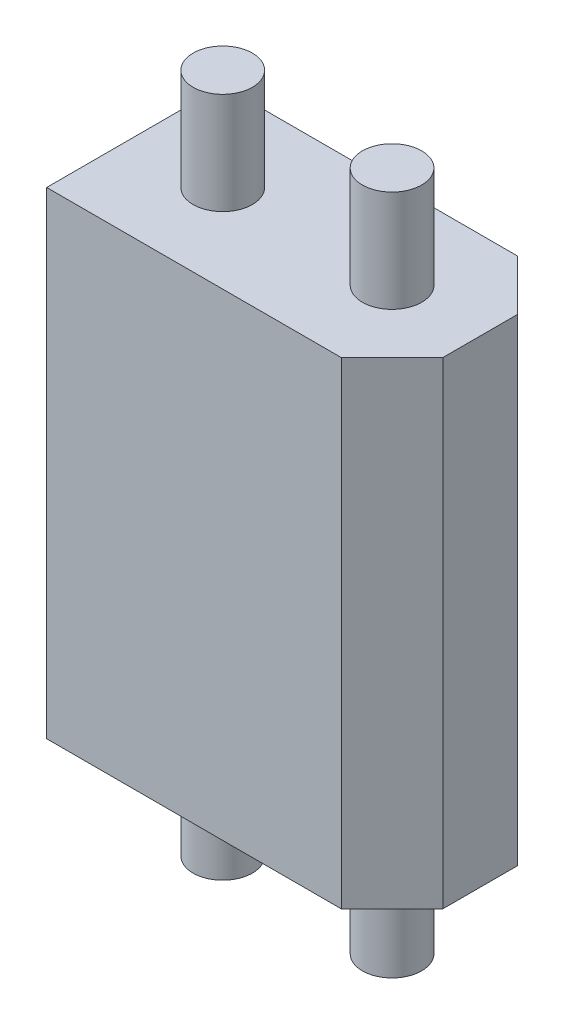
ISO-10303-21;
HEADER;
FILE_DESCRIPTION(('STEP AP214'),'2;1');
FILE_NAME('part.step','',(''),(''),'','','');
FILE_SCHEMA(('AUTOMOTIVE_DESIGN { 1 0 10303 214 1 1 1 1 }'));
ENDSEC;
DATA;
#1=APPLICATION_CONTEXT('core data for automotive mechanical design processes');
#2=APPLICATION_PROTOCOL_DEFINITION('international standard','automotive_design',2000,#1);
#3=PRODUCT_CONTEXT('',#1,'mechanical');
#4=PRODUCT('Part','Part','',(#3));
#5=PRODUCT_RELATED_PRODUCT_CATEGORY('part','',(#4));
#6=PRODUCT_DEFINITION_FORMATION('','',#4);
#7=PRODUCT_DEFINITION_CONTEXT('part definition',#1,'design');
#8=PRODUCT_DEFINITION('design','',#6,#7);
#9=PRODUCT_DEFINITION_SHAPE('','',#8);
#10=(LENGTH_UNIT() NAMED_UNIT(*) SI_UNIT(.MILLI.,.METRE.));
#11=(NAMED_UNIT(*) PLANE_ANGLE_UNIT() SI_UNIT($,.RADIAN.));
#12=(NAMED_UNIT(*) SI_UNIT($,.STERADIAN.) SOLID_ANGLE_UNIT());
#13=UNCERTAINTY_MEASURE_WITH_UNIT(LENGTH_MEASURE(1.E-05),#10,'distance_accuracy_value','');
#14=(GEOMETRIC_REPRESENTATION_CONTEXT(3) GLOBAL_UNCERTAINTY_ASSIGNED_CONTEXT((#13)) GLOBAL_UNIT_ASSIGNED_CONTEXT((#10,
#11,#12)) REPRESENTATION_CONTEXT('',''));
#15=CARTESIAN_POINT('',(0.,0.,0.));
#16=DIRECTION('',(0.,0.,1.));
#17=DIRECTION('',(1.,0.,0.));
#18=AXIS2_PLACEMENT_3D('',#15,#16,#17);
#19=CARTESIAN_POINT('',(5.1,7.05,2.6));
#20=DIRECTION('',(-1.,0.,0.));
#21=DIRECTION('',(0.,0.,1.));
#22=AXIS2_PLACEMENT_3D('',#19,#20,#21);
#23=PLANE('',#22);
#24=DIRECTION('',(0.,0.,-1.));
#25=VECTOR('',#24,1.);
#26=CARTESIAN_POINT('',(5.1,-7.05,2.6));
#27=LINE('',#26,#25);
#28=CARTESIAN_POINT('',(5.1,-7.05,1.1));
#29=VERTEX_POINT('',#28);
#30=CARTESIAN_POINT('',(5.1,-7.05,-1.1));
#31=VERTEX_POINT('',#30);
#32=EDGE_CURVE('E149',#29,#31,#27,.T.);
#33=ORIENTED_EDGE('',*,*,#32,.T.);
#34=DIRECTION('',(0.,1.,0.));
#35=VECTOR('',#34,1.);
#36=CARTESIAN_POINT('',(5.1,7.05,-1.1));
#37=LINE('',#36,#35);
#38=CARTESIAN_POINT('',(5.1,7.05,-1.1));
#39=VERTEX_POINT('',#38);
#40=EDGE_CURVE('E82',#31,#39,#37,.T.);
#41=ORIENTED_EDGE('',*,*,#40,.T.);
#42=DIRECTION('',(0.,0.,-1.));
#43=VECTOR('',#42,1.);
#44=CARTESIAN_POINT('',(5.1,7.05,2.6));
#45=LINE('',#44,#43);
#46=CARTESIAN_POINT('',(5.1,7.05,1.1));
#47=VERTEX_POINT('',#46);
#48=EDGE_CURVE('E127',#47,#39,#45,.T.);
#49=ORIENTED_EDGE('',*,*,#48,.F.);
#50=DIRECTION('',(0.,-1.,0.));
#51=VECTOR('',#50,1.);
#52=CARTESIAN_POINT('',(5.1,7.05,1.1));
#53=LINE('',#52,#51);
#54=EDGE_CURVE('E170',#47,#29,#53,.T.);
#55=ORIENTED_EDGE('',*,*,#54,.T.);
#56=EDGE_LOOP('',(#33,#41,#49,#55));
#57=FACE_BOUND('',#56,.T.);
#58=ADVANCED_FACE('F55',(#57),#23,.F.);
#59=CARTESIAN_POINT('',(-5.1,7.05,-2.6));
#60=DIRECTION('',(0.,0.,1.));
#61=DIRECTION('',(1.,0.,0.));
#62=AXIS2_PLACEMENT_3D('',#59,#60,#61);
#63=PLANE('',#62);
#64=DIRECTION('',(-1.,0.,0.));
#65=VECTOR('',#64,1.);
#66=CARTESIAN_POINT('',(-5.1,7.05,-2.6));
#67=LINE('',#66,#65);
#68=CARTESIAN_POINT('',(3.6,7.05,-2.6));
#69=VERTEX_POINT('',#68);
#70=CARTESIAN_POINT('',(-5.1,7.05,-2.6));
#71=VERTEX_POINT('',#70);
#72=EDGE_CURVE('E115',#69,#71,#67,.T.);
#73=ORIENTED_EDGE('',*,*,#72,.F.);
#74=DIRECTION('',(0.,-1.,0.));
#75=VECTOR('',#74,1.);
#76=CARTESIAN_POINT('',(3.6,7.05,-2.6));
#77=LINE('',#76,#75);
#78=CARTESIAN_POINT('',(3.6,-7.05,-2.6));
#79=VERTEX_POINT('',#78);
#80=EDGE_CURVE('E137',#69,#79,#77,.T.);
#81=ORIENTED_EDGE('',*,*,#80,.T.);
#82=DIRECTION('',(-1.,0.,0.));
#83=VECTOR('',#82,1.);
#84=CARTESIAN_POINT('',(-5.1,-7.05,-2.6));
#85=LINE('',#84,#83);
#86=CARTESIAN_POINT('',(-5.1,-7.05,-2.6));
#87=VERTEX_POINT('',#86);
#88=EDGE_CURVE('E133',#79,#87,#85,.T.);
#89=ORIENTED_EDGE('',*,*,#88,.T.);
#90=DIRECTION('',(0.,-1.,0.));
#91=VECTOR('',#90,1.);
#92=CARTESIAN_POINT('',(-5.1,7.05,-2.6));
#93=LINE('',#92,#91);
#94=EDGE_CURVE('E130',#71,#87,#93,.T.);
#95=ORIENTED_EDGE('',*,*,#94,.F.);
#96=EDGE_LOOP('',(#73,#81,#89,#95));
#97=FACE_BOUND('',#96,.T.);
#98=ADVANCED_FACE('F131',(#97),#63,.F.);
#99=CARTESIAN_POINT('',(-5.1,7.05,2.6));
#100=DIRECTION('',(1.,0.,0.));
#101=DIRECTION('',(0.,0.,-1.));
#102=AXIS2_PLACEMENT_3D('',#99,#100,#101);
#103=PLANE('',#102);
#104=DIRECTION('',(0.,0.,1.));
#105=VECTOR('',#104,1.);
#106=CARTESIAN_POINT('',(-5.1,-7.05,2.6));
#107=LINE('',#106,#105);
#108=CARTESIAN_POINT('',(-5.1,-7.05,2.6));
#109=VERTEX_POINT('',#108);
#110=EDGE_CURVE('E154',#87,#109,#107,.T.);
#111=ORIENTED_EDGE('',*,*,#110,.T.);
#112=DIRECTION('',(0.,-1.,0.));
#113=VECTOR('',#112,1.);
#114=CARTESIAN_POINT('',(-5.1,7.05,2.6));
#115=LINE('',#114,#113);
#116=CARTESIAN_POINT('',(-5.1,7.05,2.6));
#117=VERTEX_POINT('',#116);
#118=EDGE_CURVE('E138',#117,#109,#115,.T.);
#119=ORIENTED_EDGE('',*,*,#118,.F.);
#120=DIRECTION('',(0.,0.,1.));
#121=VECTOR('',#120,1.);
#122=CARTESIAN_POINT('',(-5.1,7.05,2.6));
#123=LINE('',#122,#121);
#124=EDGE_CURVE('E119',#71,#117,#123,.T.);
#125=ORIENTED_EDGE('',*,*,#124,.F.);
#126=ORIENTED_EDGE('',*,*,#94,.T.);
#127=EDGE_LOOP('',(#111,#119,#125,#126));
#128=FACE_BOUND('',#127,.T.);
#129=ADVANCED_FACE('F140',(#128),#103,.F.);
#130=CARTESIAN_POINT('',(-5.1,7.05,2.6));
#131=DIRECTION('',(0.,0.,-1.));
#132=DIRECTION('',(-1.,0.,0.));
#133=AXIS2_PLACEMENT_3D('',#130,#131,#132);
#134=PLANE('',#133);
#135=DIRECTION('',(1.,0.,0.));
#136=VECTOR('',#135,1.);
#137=CARTESIAN_POINT('',(-5.1,-7.05,2.6));
#138=LINE('',#137,#136);
#139=CARTESIAN_POINT('',(3.6,-7.05,2.6));
#140=VERTEX_POINT('',#139);
#141=EDGE_CURVE('E157',#109,#140,#138,.T.);
#142=ORIENTED_EDGE('',*,*,#141,.T.);
#143=DIRECTION('',(0.,1.,0.));
#144=VECTOR('',#143,1.);
#145=CARTESIAN_POINT('',(3.6,7.05,2.6));
#146=LINE('',#145,#144);
#147=CARTESIAN_POINT('',(3.6,7.05,2.6));
#148=VERTEX_POINT('',#147);
#149=EDGE_CURVE('E74',#140,#148,#146,.T.);
#150=ORIENTED_EDGE('',*,*,#149,.T.);
#151=DIRECTION('',(1.,0.,0.));
#152=VECTOR('',#151,1.);
#153=CARTESIAN_POINT('',(-5.1,7.05,2.6));
#154=LINE('',#153,#152);
#155=EDGE_CURVE('E143',#117,#148,#154,.T.);
#156=ORIENTED_EDGE('',*,*,#155,.F.);
#157=ORIENTED_EDGE('',*,*,#118,.T.);
#158=EDGE_LOOP('',(#142,#150,#156,#157));
#159=FACE_BOUND('',#158,.T.);
#160=ADVANCED_FACE('F219',(#159),#134,.F.);
#161=CARTESIAN_POINT('',(0.,7.05,0.));
#162=DIRECTION('',(0.,-1.,0.));
#163=DIRECTION('',(0.,0.,-1.));
#164=AXIS2_PLACEMENT_3D('',#161,#162,#163);
#165=PLANE('',#164);
#166=CARTESIAN_POINT('',(-2.5,7.05,0.));
#167=DIRECTION('',(0.,-1.,0.));
#168=DIRECTION('',(0.,0.,-1.));
#169=AXIS2_PLACEMENT_3D('',#166,#167,#168);
#170=CIRCLE('',#169,0.875);
#171=CARTESIAN_POINT('',(-2.5,7.05,-0.875));
#172=VERTEX_POINT('',#171);
#173=EDGE_CURVE('E12',#172,#172,#170,.F.);
#174=ORIENTED_EDGE('',*,*,#173,.F.);
#175=EDGE_LOOP('',(#174));
#176=FACE_BOUND('',#175,.T.);
#177=CARTESIAN_POINT('',(2.5,7.05,0.));
#178=DIRECTION('',(0.,-1.,0.));
#179=DIRECTION('',(0.,0.,-1.));
#180=AXIS2_PLACEMENT_3D('',#177,#178,#179);
#181=CIRCLE('',#180,0.875);
#182=CARTESIAN_POINT('',(2.5,7.05,-0.875000000000001));
#183=VERTEX_POINT('',#182);
#184=EDGE_CURVE('E66',#183,#183,#181,.F.);
#185=ORIENTED_EDGE('',*,*,#184,.F.);
#186=EDGE_LOOP('',(#185));
#187=FACE_BOUND('',#186,.T.);
#188=ORIENTED_EDGE('',*,*,#48,.T.);
#189=DIRECTION('',(0.707106781186547,0.,0.707106781186548));
#190=VECTOR('',#189,1.);
#191=CARTESIAN_POINT('',(3.6,7.05,-2.6));
#192=LINE('',#191,#190);
#193=EDGE_CURVE('E122',#39,#69,#192,.F.);
#194=ORIENTED_EDGE('',*,*,#193,.T.);
#195=ORIENTED_EDGE('',*,*,#72,.T.);
#196=ORIENTED_EDGE('',*,*,#124,.T.);
#197=ORIENTED_EDGE('',*,*,#155,.T.);
#198=DIRECTION('',(-0.707106781186548,0.,0.707106781186547));
#199=VECTOR('',#198,1.);
#200=CARTESIAN_POINT('',(5.1,7.05,1.1));
#201=LINE('',#200,#199);
#202=EDGE_CURVE('E176',#148,#47,#201,.F.);
#203=ORIENTED_EDGE('',*,*,#202,.T.);
#204=EDGE_LOOP('',(#188,#194,#195,#196,#197,#203));
#205=FACE_BOUND('',#204,.T.);
#206=ADVANCED_FACE('F117',(#176,#187,#205),#165,.F.);
#207=CARTESIAN_POINT('',(0.,-7.05,0.));
#208=DIRECTION('',(0.,-1.,0.));
#209=DIRECTION('',(0.,0.,-1.));
#210=AXIS2_PLACEMENT_3D('',#207,#208,#209);
#211=PLANE('',#210);
#212=CARTESIAN_POINT('',(-2.5,-7.05,0.));
#213=DIRECTION('',(0.,-1.,0.));
#214=DIRECTION('',(0.,0.,-1.));
#215=AXIS2_PLACEMENT_3D('',#212,#213,#214);
#216=CIRCLE('',#215,0.875);
#217=CARTESIAN_POINT('',(-2.5,-7.05,-0.875));
#218=VERTEX_POINT('',#217);
#219=EDGE_CURVE('E60',#218,#218,#216,.F.);
#220=ORIENTED_EDGE('',*,*,#219,.T.);
#221=EDGE_LOOP('',(#220));
#222=FACE_BOUND('',#221,.T.);
#223=CARTESIAN_POINT('',(2.5,-7.05,0.));
#224=DIRECTION('',(0.,-1.,0.));
#225=DIRECTION('',(0.,0.,-1.));
#226=AXIS2_PLACEMENT_3D('',#223,#224,#225);
#227=CIRCLE('',#226,0.875);
#228=CARTESIAN_POINT('',(2.5,-7.05,-0.875000000000001));
#229=VERTEX_POINT('',#228);
#230=EDGE_CURVE('E182',#229,#229,#227,.F.);
#231=ORIENTED_EDGE('',*,*,#230,.T.);
#232=EDGE_LOOP('',(#231));
#233=FACE_BOUND('',#232,.T.);
#234=ORIENTED_EDGE('',*,*,#88,.F.);
#235=DIRECTION('',(-0.707106781186547,0.,-0.707106781186548));
#236=VECTOR('',#235,1.);
#237=CARTESIAN_POINT('',(3.1,-7.05,-3.1));
#238=LINE('',#237,#236);
#239=EDGE_CURVE('E167',#79,#31,#238,.F.);
#240=ORIENTED_EDGE('',*,*,#239,.T.);
#241=ORIENTED_EDGE('',*,*,#32,.F.);
#242=DIRECTION('',(0.707106781186548,0.,-0.707106781186547));
#243=VECTOR('',#242,1.);
#244=CARTESIAN_POINT('',(3.09999999999999,-7.05,3.1));
#245=LINE('',#244,#243);
#246=EDGE_CURVE('E164',#29,#140,#245,.F.);
#247=ORIENTED_EDGE('',*,*,#246,.T.);
#248=ORIENTED_EDGE('',*,*,#141,.F.);
#249=ORIENTED_EDGE('',*,*,#110,.F.);
#250=EDGE_LOOP('',(#234,#240,#241,#247,#248,#249));
#251=FACE_BOUND('',#250,.T.);
#252=ADVANCED_FACE('F216',(#222,#233,#251),#211,.T.);
#253=CARTESIAN_POINT('',(3.6,7.05,-2.6));
#254=DIRECTION('',(-0.707106781186548,0.,0.707106781186547));
#255=DIRECTION('',(0.,-1.,0.));
#256=AXIS2_PLACEMENT_3D('',#253,#254,#255);
#257=PLANE('',#256);
#258=ORIENTED_EDGE('',*,*,#193,.F.);
#259=ORIENTED_EDGE('',*,*,#40,.F.);
#260=ORIENTED_EDGE('',*,*,#239,.F.);
#261=ORIENTED_EDGE('',*,*,#80,.F.);
#262=EDGE_LOOP('',(#258,#259,#260,#261));
#263=FACE_BOUND('',#262,.T.);
#264=ADVANCED_FACE('F214',(#263),#257,.F.);
#265=CARTESIAN_POINT('',(5.1,7.05,1.1));
#266=DIRECTION('',(-0.707106781186547,0.,-0.707106781186548));
#267=DIRECTION('',(0.,-1.,0.));
#268=AXIS2_PLACEMENT_3D('',#265,#266,#267);
#269=PLANE('',#268);
#270=ORIENTED_EDGE('',*,*,#202,.F.);
#271=ORIENTED_EDGE('',*,*,#149,.F.);
#272=ORIENTED_EDGE('',*,*,#246,.F.);
#273=ORIENTED_EDGE('',*,*,#54,.F.);
#274=EDGE_LOOP('',(#270,#271,#272,#273));
#275=FACE_BOUND('',#274,.T.);
#276=ADVANCED_FACE('F58',(#275),#269,.F.);
#277=CARTESIAN_POINT('',(0.,-10.05,0.));
#278=DIRECTION('',(0.,-1.,0.));
#279=DIRECTION('',(0.,0.,-1.));
#280=AXIS2_PLACEMENT_3D('',#277,#278,#279);
#281=PLANE('',#280);
#282=CARTESIAN_POINT('',(2.5,-10.05,0.));
#283=DIRECTION('',(0.,-1.,0.));
#284=DIRECTION('',(0.,0.,-1.));
#285=AXIS2_PLACEMENT_3D('',#282,#283,#284);
#286=CIRCLE('',#285,0.875);
#287=CARTESIAN_POINT('',(2.5,-10.05,-0.875000000000001));
#288=VERTEX_POINT('',#287);
#289=EDGE_CURVE('E198',#288,#288,#286,.F.);
#290=ORIENTED_EDGE('',*,*,#289,.F.);
#291=EDGE_LOOP('',(#290));
#292=FACE_BOUND('',#291,.T.);
#293=ADVANCED_FACE('F237',(#292),#281,.T.);
#294=CARTESIAN_POINT('',(2.5,15.5248737341529,0.));
#295=DIRECTION('',(0.,-1.,0.));
#296=DIRECTION('',(0.,0.,-1.));
#297=AXIS2_PLACEMENT_3D('',#294,#295,#296);
#298=CYLINDRICAL_SURFACE('',#297,0.875);
#299=ORIENTED_EDGE('',*,*,#230,.F.);
#300=EDGE_LOOP('',(#299));
#301=FACE_BOUND('',#300,.T.);
#302=ORIENTED_EDGE('',*,*,#289,.T.);
#303=EDGE_LOOP('',(#302));
#304=FACE_BOUND('',#303,.T.);
#305=ADVANCED_FACE('F297',(#301,#304),#298,.T.);
#306=CARTESIAN_POINT('',(0.,-10.05,0.));
#307=DIRECTION('',(0.,-1.,0.));
#308=DIRECTION('',(0.,0.,-1.));
#309=AXIS2_PLACEMENT_3D('',#306,#307,#308);
#310=PLANE('',#309);
#311=CARTESIAN_POINT('',(-2.5,-10.05,0.));
#312=DIRECTION('',(0.,-1.,0.));
#313=DIRECTION('',(0.,0.,-1.));
#314=AXIS2_PLACEMENT_3D('',#311,#312,#313);
#315=CIRCLE('',#314,0.875);
#316=CARTESIAN_POINT('',(-2.5,-10.05,-0.875));
#317=VERTEX_POINT('',#316);
#318=EDGE_CURVE('E192',#317,#317,#315,.F.);
#319=ORIENTED_EDGE('',*,*,#318,.F.);
#320=EDGE_LOOP('',(#319));
#321=FACE_BOUND('',#320,.T.);
#322=ADVANCED_FACE('F308',(#321),#310,.T.);
#323=CARTESIAN_POINT('',(-2.5,15.5248737341529,0.));
#324=DIRECTION('',(0.,-1.,0.));
#325=DIRECTION('',(0.,0.,-1.));
#326=AXIS2_PLACEMENT_3D('',#323,#324,#325);
#327=CYLINDRICAL_SURFACE('',#326,0.875);
#328=ORIENTED_EDGE('',*,*,#219,.F.);
#329=EDGE_LOOP('',(#328));
#330=FACE_BOUND('',#329,.T.);
#331=ORIENTED_EDGE('',*,*,#318,.T.);
#332=EDGE_LOOP('',(#331));
#333=FACE_BOUND('',#332,.T.);
#334=ADVANCED_FACE('F321',(#330,#333),#327,.T.);
#335=CARTESIAN_POINT('',(2.5,10.05,0.));
#336=DIRECTION('',(0.,-1.,0.));
#337=DIRECTION('',(0.,0.,-1.));
#338=AXIS2_PLACEMENT_3D('',#335,#336,#337);
#339=CIRCLE('',#338,0.875);
#340=CARTESIAN_POINT('',(2.5,10.05,-0.875000000000001));
#341=VERTEX_POINT('',#340);
#342=EDGE_CURVE('E201',#341,#341,#339,.T.);
#343=ORIENTED_EDGE('',*,*,#342,.T.);
#344=EDGE_LOOP('',(#343));
#345=FACE_BOUND('',#344,.T.);
#346=ORIENTED_EDGE('',*,*,#184,.T.);
#347=EDGE_LOOP('',(#346));
#348=FACE_BOUND('',#347,.T.);
#349=ADVANCED_FACE('F311',(#345,#348),#298,.T.);
#350=CARTESIAN_POINT('',(0.,10.05,0.));
#351=DIRECTION('',(0.,-1.,0.));
#352=DIRECTION('',(0.,0.,-1.));
#353=AXIS2_PLACEMENT_3D('',#350,#351,#352);
#354=PLANE('',#353);
#355=ORIENTED_EDGE('',*,*,#342,.F.);
#356=EDGE_LOOP('',(#355));
#357=FACE_BOUND('',#356,.T.);
#358=ADVANCED_FACE('F345',(#357),#354,.F.);
#359=CARTESIAN_POINT('',(-2.5,10.05,0.));
#360=DIRECTION('',(0.,-1.,0.));
#361=DIRECTION('',(0.,0.,-1.));
#362=AXIS2_PLACEMENT_3D('',#359,#360,#361);
#363=CIRCLE('',#362,0.875);
#364=CARTESIAN_POINT('',(-2.5,10.05,-0.875));
#365=VERTEX_POINT('',#364);
#366=EDGE_CURVE('E185',#365,#365,#363,.T.);
#367=ORIENTED_EDGE('',*,*,#366,.T.);
#368=EDGE_LOOP('',(#367));
#369=FACE_BOUND('',#368,.T.);
#370=ORIENTED_EDGE('',*,*,#173,.T.);
#371=EDGE_LOOP('',(#370));
#372=FACE_BOUND('',#371,.T.);
#373=ADVANCED_FACE('F335',(#369,#372),#327,.T.);
#374=CARTESIAN_POINT('',(0.,10.05,0.));
#375=DIRECTION('',(0.,-1.,0.));
#376=DIRECTION('',(0.,0.,-1.));
#377=AXIS2_PLACEMENT_3D('',#374,#375,#376);
#378=PLANE('',#377);
#379=ORIENTED_EDGE('',*,*,#366,.F.);
#380=EDGE_LOOP('',(#379));
#381=FACE_BOUND('',#380,.T.);
#382=ADVANCED_FACE('F367',(#381),#378,.F.);
#383=CLOSED_SHELL('',(#58,#98,#129,#160,#206,#252,#264,#276,#293,#305,#322,#334,#349,#358,#373,#382));
#384=MANIFOLD_SOLID_BREP('B2',#383);
#385=ADVANCED_BREP_SHAPE_REPRESENTATION('',(#18,#384),#14);
#386=SHAPE_DEFINITION_REPRESENTATION(#9,#385);
ENDSEC;
END-ISO-10303-21;
